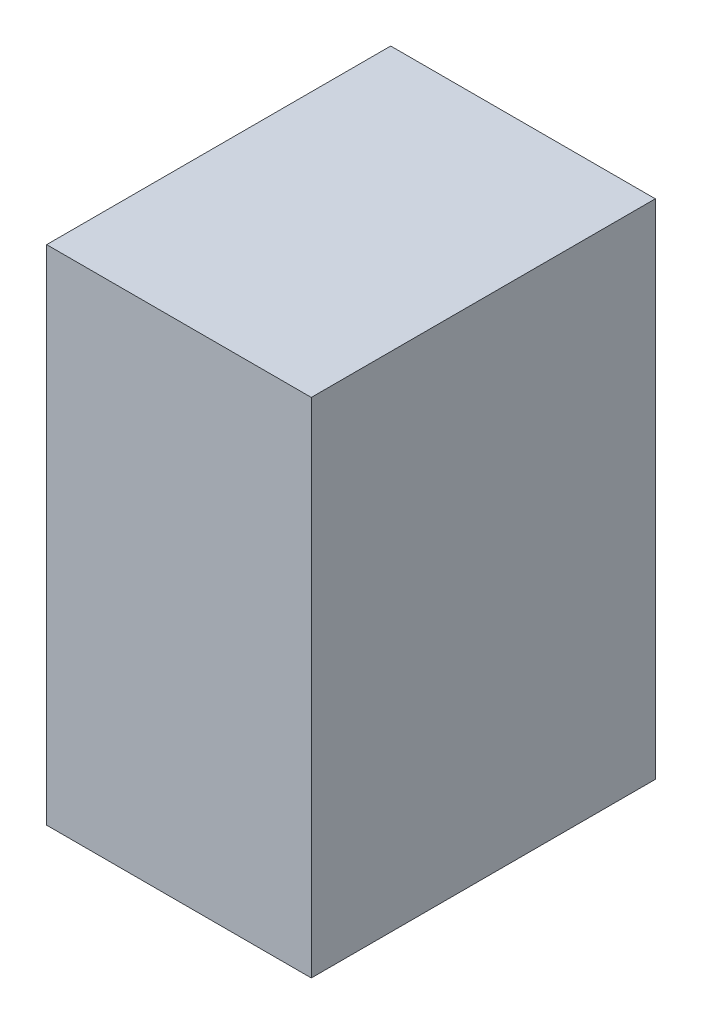
ISO-10303-21;
HEADER;
FILE_DESCRIPTION(('STEP AP214'),'2;1');
FILE_NAME('part.step','',(''),(''),'','','');
FILE_SCHEMA(('AUTOMOTIVE_DESIGN { 1 0 10303 214 1 1 1 1 }'));
ENDSEC;
DATA;
#1=APPLICATION_CONTEXT('core data for automotive mechanical design processes');
#2=APPLICATION_PROTOCOL_DEFINITION('international standard','automotive_design',2000,#1);
#3=PRODUCT_CONTEXT('',#1,'mechanical');
#4=PRODUCT('Part','Part','',(#3));
#5=PRODUCT_RELATED_PRODUCT_CATEGORY('part','',(#4));
#6=PRODUCT_DEFINITION_FORMATION('','',#4);
#7=PRODUCT_DEFINITION_CONTEXT('part definition',#1,'design');
#8=PRODUCT_DEFINITION('design','',#6,#7);
#9=PRODUCT_DEFINITION_SHAPE('','',#8);
#10=(LENGTH_UNIT() NAMED_UNIT(*) SI_UNIT(.MILLI.,.METRE.));
#11=(NAMED_UNIT(*) PLANE_ANGLE_UNIT() SI_UNIT($,.RADIAN.));
#12=(NAMED_UNIT(*) SI_UNIT($,.STERADIAN.) SOLID_ANGLE_UNIT());
#13=UNCERTAINTY_MEASURE_WITH_UNIT(LENGTH_MEASURE(1.E-05),#10,'distance_accuracy_value','');
#14=(GEOMETRIC_REPRESENTATION_CONTEXT(3) GLOBAL_UNCERTAINTY_ASSIGNED_CONTEXT((#13)) GLOBAL_UNIT_ASSIGNED_CONTEXT((#10,
#11,#12)) REPRESENTATION_CONTEXT('',''));
#15=CARTESIAN_POINT('',(0.,0.,0.));
#16=DIRECTION('',(0.,0.,1.));
#17=DIRECTION('',(1.,0.,0.));
#18=AXIS2_PLACEMENT_3D('',#15,#16,#17);
#19=CARTESIAN_POINT('',(-5.,-9.5,6.5));
#20=DIRECTION('',(0.,0.,1.));
#21=DIRECTION('',(1.,0.,0.));
#22=AXIS2_PLACEMENT_3D('',#19,#20,#21);
#23=PLANE('',#22);
#24=DIRECTION('',(0.,1.,0.));
#25=VECTOR('',#24,1.);
#26=CARTESIAN_POINT('',(-5.,-9.5,6.5));
#27=LINE('',#26,#25);
#28=CARTESIAN_POINT('',(-5.,-9.5,6.5));
#29=VERTEX_POINT('',#28);
#30=CARTESIAN_POINT('',(-5.,9.5,6.5));
#31=VERTEX_POINT('',#30);
#32=EDGE_CURVE('E57',#29,#31,#27,.T.);
#33=ORIENTED_EDGE('',*,*,#32,.F.);
#34=DIRECTION('',(1.,0.,0.));
#35=VECTOR('',#34,1.);
#36=CARTESIAN_POINT('',(-5.,-9.5,6.5));
#37=LINE('',#36,#35);
#38=CARTESIAN_POINT('',(5.,-9.5,6.5));
#39=VERTEX_POINT('',#38);
#40=EDGE_CURVE('E51',#29,#39,#37,.T.);
#41=ORIENTED_EDGE('',*,*,#40,.T.);
#42=DIRECTION('',(0.,1.,0.));
#43=VECTOR('',#42,1.);
#44=CARTESIAN_POINT('',(5.,-9.5,6.5));
#45=LINE('',#44,#43);
#46=CARTESIAN_POINT('',(5.,9.5,6.5));
#47=VERTEX_POINT('',#46);
#48=EDGE_CURVE('E53',#39,#47,#45,.T.);
#49=ORIENTED_EDGE('',*,*,#48,.T.);
#50=DIRECTION('',(1.,0.,0.));
#51=VECTOR('',#50,1.);
#52=CARTESIAN_POINT('',(-5.,9.5,6.5));
#53=LINE('',#52,#51);
#54=EDGE_CURVE('E9',#31,#47,#53,.T.);
#55=ORIENTED_EDGE('',*,*,#54,.F.);
#56=EDGE_LOOP('',(#33,#41,#49,#55));
#57=FACE_BOUND('',#56,.T.);
#58=ADVANCED_FACE('F15',(#57),#23,.T.);
#59=CARTESIAN_POINT('',(-5.,-9.5,-6.5));
#60=DIRECTION('',(0.,0.,1.));
#61=DIRECTION('',(1.,0.,0.));
#62=AXIS2_PLACEMENT_3D('',#59,#60,#61);
#63=PLANE('',#62);
#64=DIRECTION('',(1.,0.,0.));
#65=VECTOR('',#64,1.);
#66=CARTESIAN_POINT('',(-5.,9.5,-6.5));
#67=LINE('',#66,#65);
#68=CARTESIAN_POINT('',(-5.,9.5,-6.5));
#69=VERTEX_POINT('',#68);
#70=CARTESIAN_POINT('',(5.,9.5,-6.5));
#71=VERTEX_POINT('',#70);
#72=EDGE_CURVE('E24',#69,#71,#67,.T.);
#73=ORIENTED_EDGE('',*,*,#72,.T.);
#74=DIRECTION('',(0.,1.,0.));
#75=VECTOR('',#74,1.);
#76=CARTESIAN_POINT('',(5.,-9.5,-6.5));
#77=LINE('',#76,#75);
#78=CARTESIAN_POINT('',(5.,-9.5,-6.5));
#79=VERTEX_POINT('',#78);
#80=EDGE_CURVE('E77',#79,#71,#77,.T.);
#81=ORIENTED_EDGE('',*,*,#80,.F.);
#82=DIRECTION('',(1.,0.,0.));
#83=VECTOR('',#82,1.);
#84=CARTESIAN_POINT('',(-5.,-9.5,-6.5));
#85=LINE('',#84,#83);
#86=CARTESIAN_POINT('',(-5.,-9.5,-6.5));
#87=VERTEX_POINT('',#86);
#88=EDGE_CURVE('E63',#87,#79,#85,.T.);
#89=ORIENTED_EDGE('',*,*,#88,.F.);
#90=DIRECTION('',(0.,1.,0.));
#91=VECTOR('',#90,1.);
#92=CARTESIAN_POINT('',(-5.,-9.5,-6.5));
#93=LINE('',#92,#91);
#94=EDGE_CURVE('E84',#87,#69,#93,.T.);
#95=ORIENTED_EDGE('',*,*,#94,.T.);
#96=EDGE_LOOP('',(#73,#81,#89,#95));
#97=FACE_BOUND('',#96,.T.);
#98=ADVANCED_FACE('F109',(#97),#63,.F.);
#99=CARTESIAN_POINT('',(-5.,9.5,-6.5));
#100=DIRECTION('',(0.,1.,0.));
#101=DIRECTION('',(1.,0.,0.));
#102=AXIS2_PLACEMENT_3D('',#99,#100,#101);
#103=PLANE('',#102);
#104=ORIENTED_EDGE('',*,*,#72,.F.);
#105=DIRECTION('',(0.,0.,1.));
#106=VECTOR('',#105,1.);
#107=CARTESIAN_POINT('',(-5.,9.5,-6.5));
#108=LINE('',#107,#106);
#109=EDGE_CURVE('E158',#69,#31,#108,.T.);
#110=ORIENTED_EDGE('',*,*,#109,.T.);
#111=ORIENTED_EDGE('',*,*,#54,.T.);
#112=DIRECTION('',(0.,0.,1.));
#113=VECTOR('',#112,1.);
#114=CARTESIAN_POINT('',(5.,9.5,-6.5));
#115=LINE('',#114,#113);
#116=EDGE_CURVE('E70',#71,#47,#115,.T.);
#117=ORIENTED_EDGE('',*,*,#116,.F.);
#118=EDGE_LOOP('',(#104,#110,#111,#117));
#119=FACE_BOUND('',#118,.T.);
#120=ADVANCED_FACE('F114',(#119),#103,.T.);
#121=CARTESIAN_POINT('',(-5.,-9.5,-6.5));
#122=DIRECTION('',(0.,1.,0.));
#123=DIRECTION('',(1.,0.,0.));
#124=AXIS2_PLACEMENT_3D('',#121,#122,#123);
#125=PLANE('',#124);
#126=DIRECTION('',(0.,0.,1.));
#127=VECTOR('',#126,1.);
#128=CARTESIAN_POINT('',(5.,-9.5,-6.5));
#129=LINE('',#128,#127);
#130=EDGE_CURVE('E69',#79,#39,#129,.T.);
#131=ORIENTED_EDGE('',*,*,#130,.T.);
#132=ORIENTED_EDGE('',*,*,#40,.F.);
#133=DIRECTION('',(0.,0.,1.));
#134=VECTOR('',#133,1.);
#135=CARTESIAN_POINT('',(-5.,-9.5,-6.5));
#136=LINE('',#135,#134);
#137=EDGE_CURVE('E78',#87,#29,#136,.T.);
#138=ORIENTED_EDGE('',*,*,#137,.F.);
#139=ORIENTED_EDGE('',*,*,#88,.T.);
#140=EDGE_LOOP('',(#131,#132,#138,#139));
#141=FACE_BOUND('',#140,.T.);
#142=ADVANCED_FACE('F73',(#141),#125,.F.);
#143=CARTESIAN_POINT('',(5.,-9.5,-6.5));
#144=DIRECTION('',(1.,0.,0.));
#145=DIRECTION('',(0.,1.,0.));
#146=AXIS2_PLACEMENT_3D('',#143,#144,#145);
#147=PLANE('',#146);
#148=ORIENTED_EDGE('',*,*,#130,.F.);
#149=ORIENTED_EDGE('',*,*,#80,.T.);
#150=ORIENTED_EDGE('',*,*,#116,.T.);
#151=ORIENTED_EDGE('',*,*,#48,.F.);
#152=EDGE_LOOP('',(#148,#149,#150,#151));
#153=FACE_BOUND('',#152,.T.);
#154=ADVANCED_FACE('F67',(#153),#147,.T.);
#155=CARTESIAN_POINT('',(-5.,-9.5,-6.5));
#156=DIRECTION('',(1.,0.,0.));
#157=DIRECTION('',(0.,1.,0.));
#158=AXIS2_PLACEMENT_3D('',#155,#156,#157);
#159=PLANE('',#158);
#160=ORIENTED_EDGE('',*,*,#32,.T.);
#161=ORIENTED_EDGE('',*,*,#109,.F.);
#162=ORIENTED_EDGE('',*,*,#94,.F.);
#163=ORIENTED_EDGE('',*,*,#137,.T.);
#164=EDGE_LOOP('',(#160,#161,#162,#163));
#165=FACE_BOUND('',#164,.T.);
#166=ADVANCED_FACE('F98',(#165),#159,.F.);
#167=CLOSED_SHELL('',(#58,#98,#120,#142,#154,#166));
#168=MANIFOLD_SOLID_BREP('B1',#167);
#169=ADVANCED_BREP_SHAPE_REPRESENTATION('',(#18,#168),#14);
#170=SHAPE_DEFINITION_REPRESENTATION(#9,#169);
ENDSEC;
END-ISO-10303-21;
